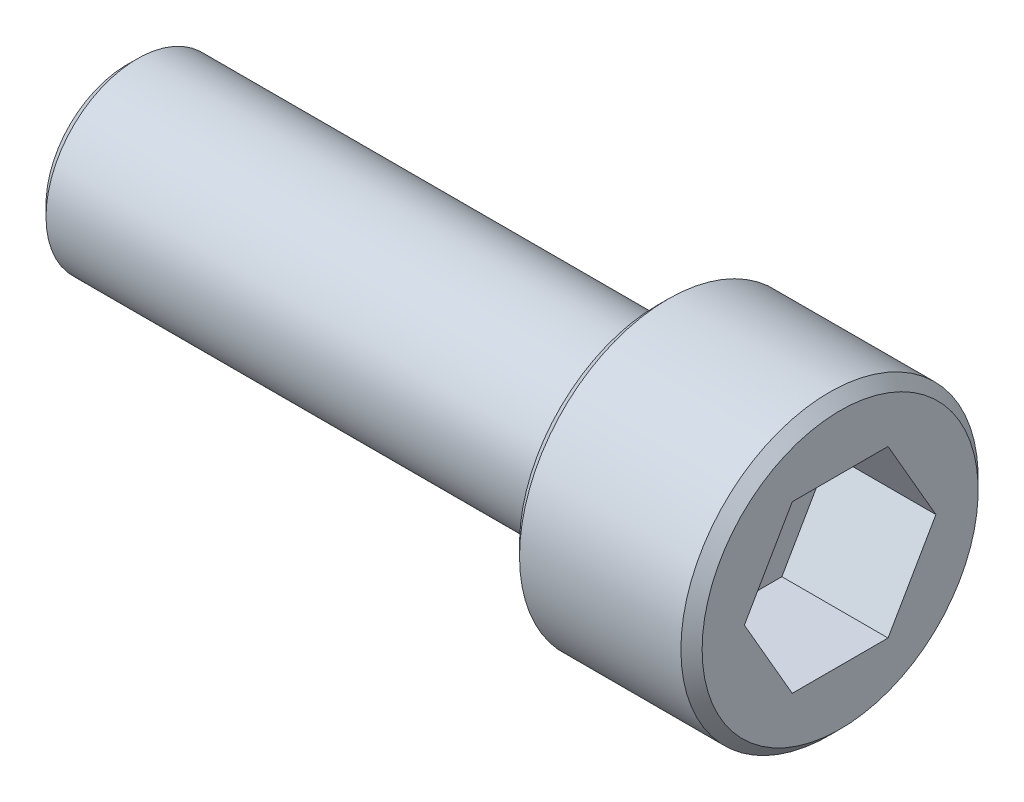
ISO-10303-21;
HEADER;
FILE_DESCRIPTION(('STEP AP214'),'2;1');
FILE_NAME('part.step','',(''),(''),'','','');
FILE_SCHEMA(('AUTOMOTIVE_DESIGN { 1 0 10303 214 1 1 1 1 }'));
ENDSEC;
DATA;
#1=APPLICATION_CONTEXT('core data for automotive mechanical design processes');
#2=APPLICATION_PROTOCOL_DEFINITION('international standard','automotive_design',2000,#1);
#3=PRODUCT_CONTEXT('',#1,'mechanical');
#4=PRODUCT('Part','Part','',(#3));
#5=PRODUCT_RELATED_PRODUCT_CATEGORY('part','',(#4));
#6=PRODUCT_DEFINITION_FORMATION('','',#4);
#7=PRODUCT_DEFINITION_CONTEXT('part definition',#1,'design');
#8=PRODUCT_DEFINITION('design','',#6,#7);
#9=PRODUCT_DEFINITION_SHAPE('','',#8);
#10=(LENGTH_UNIT() NAMED_UNIT(*) SI_UNIT(.MILLI.,.METRE.));
#11=(NAMED_UNIT(*) PLANE_ANGLE_UNIT() SI_UNIT($,.RADIAN.));
#12=(NAMED_UNIT(*) SI_UNIT($,.STERADIAN.) SOLID_ANGLE_UNIT());
#13=UNCERTAINTY_MEASURE_WITH_UNIT(LENGTH_MEASURE(1.E-05),#10,'distance_accuracy_value','');
#14=(GEOMETRIC_REPRESENTATION_CONTEXT(3) GLOBAL_UNCERTAINTY_ASSIGNED_CONTEXT((#13)) GLOBAL_UNIT_ASSIGNED_CONTEXT((#10,
#11,#12)) REPRESENTATION_CONTEXT('',''));
#15=CARTESIAN_POINT('',(0.,0.,0.));
#16=DIRECTION('',(0.,0.,1.));
#17=DIRECTION('',(1.,0.,0.));
#18=AXIS2_PLACEMENT_3D('',#15,#16,#17);
#19=CARTESIAN_POINT('',(7.2644,0.992187500000026,-0.572839720211604));
#20=DIRECTION('',(1.,0.,0.));
#21=DIRECTION('',(0.,0.,-1.));
#22=AXIS2_PLACEMENT_3D('',#19,#20,#21);
#23=PLANE('',#22);
#24=DIRECTION('',(0.,0.,1.));
#25=VECTOR('',#24,1.);
#26=CARTESIAN_POINT('',(7.26439999999923,-0.992187499999957,0.572839720211604));
#27=LINE('',#26,#25);
#28=CARTESIAN_POINT('',(7.26439999999981,-0.992187499999961,0.572839720211611));
#29=VERTEX_POINT('',#28);
#30=CARTESIAN_POINT('',(7.26439999999942,-0.9921875,-0.572839720211579));
#31=VERTEX_POINT('',#30);
#32=EDGE_CURVE('E90',#29,#31,#27,.F.);
#33=ORIENTED_EDGE('',*,*,#32,.T.);
#34=DIRECTION('',(0.,0.866025403784435,-0.500000000000006));
#35=VECTOR('',#34,1.);
#36=CARTESIAN_POINT('',(7.26439999999923,-0.992187499999957,-0.572839720211604));
#37=LINE('',#36,#35);
#38=CARTESIAN_POINT('',(7.26439999999962,0.,-1.14567944042315));
#39=VERTEX_POINT('',#38);
#40=EDGE_CURVE('E134',#31,#39,#37,.T.);
#41=ORIENTED_EDGE('',*,*,#40,.T.);
#42=DIRECTION('',(0.,0.866025403784435,0.500000000000006));
#43=VECTOR('',#42,1.);
#44=CARTESIAN_POINT('',(7.2644,0.,-1.1456794404231));
#45=LINE('',#44,#43);
#46=CARTESIAN_POINT('',(7.2644,0.992187500000006,-0.57283972021157));
#47=VERTEX_POINT('',#46);
#48=EDGE_CURVE('E129',#39,#47,#45,.T.);
#49=ORIENTED_EDGE('',*,*,#48,.T.);
#50=DIRECTION('',(0.,0.,1.));
#51=VECTOR('',#50,1.);
#52=CARTESIAN_POINT('',(7.2644,0.992187500000026,-0.572839720211604));
#53=LINE('',#52,#51);
#54=CARTESIAN_POINT('',(7.2644,0.992187499999989,0.572839720211632));
#55=VERTEX_POINT('',#54);
#56=EDGE_CURVE('E73',#47,#55,#53,.T.);
#57=ORIENTED_EDGE('',*,*,#56,.T.);
#58=DIRECTION('',(0.,-0.866025403784435,0.500000000000006));
#59=VECTOR('',#58,1.);
#60=CARTESIAN_POINT('',(7.2644,0.99218750000004,0.572839720211604));
#61=LINE('',#60,#59);
#62=CARTESIAN_POINT('',(7.26440000000001,0.,1.14567944042318));
#63=VERTEX_POINT('',#62);
#64=EDGE_CURVE('E70',#55,#63,#61,.T.);
#65=ORIENTED_EDGE('',*,*,#64,.T.);
#66=DIRECTION('',(0.,-0.866025403784435,-0.500000000000006));
#67=VECTOR('',#66,1.);
#68=CARTESIAN_POINT('',(7.2644,0.,1.14567944042321));
#69=LINE('',#68,#67);
#70=EDGE_CURVE('E67',#63,#29,#69,.T.);
#71=ORIENTED_EDGE('',*,*,#70,.T.);
#72=EDGE_LOOP('',(#33,#41,#49,#57,#65,#71));
#73=FACE_BOUND('',#72,.T.);
#74=ADVANCED_FACE('F16',(#73),#23,.T.);
#75=CARTESIAN_POINT('',(7.2644,0.99218750000004,0.572839720211604));
#76=DIRECTION('',(0.,0.500000000000006,0.866025403784435));
#77=DIRECTION('',(0.,-0.866025403784435,0.500000000000006));
#78=AXIS2_PLACEMENT_3D('',#75,#76,#77);
#79=PLANE('',#78);
#80=DIRECTION('',(1.,0.,0.));
#81=VECTOR('',#80,1.);
#82=CARTESIAN_POINT('',(7.2644,-1.2665089224229E-13,1.14567944042312));
#83=LINE('',#82,#81);
#84=CARTESIAN_POINT('',(8.5343999999998,0.,1.14567944042318));
#85=VERTEX_POINT('',#84);
#86=EDGE_CURVE('E76',#85,#63,#83,.F.);
#87=ORIENTED_EDGE('',*,*,#86,.T.);
#88=ORIENTED_EDGE('',*,*,#64,.F.);
#89=DIRECTION('',(1.,0.,0.));
#90=VECTOR('',#89,1.);
#91=CARTESIAN_POINT('',(7.2644,0.992187500000026,0.572839720211604));
#92=LINE('',#91,#90);
#93=CARTESIAN_POINT('',(8.5344,0.992187499999902,0.572839720211651));
#94=VERTEX_POINT('',#93);
#95=EDGE_CURVE('E124',#55,#94,#92,.T.);
#96=ORIENTED_EDGE('',*,*,#95,.T.);
#97=DIRECTION('',(0.,-0.866025403784431,0.500000000000013));
#98=VECTOR('',#97,1.);
#99=CARTESIAN_POINT('',(8.5344,0.992187499999825,0.572839720211604));
#100=LINE('',#99,#98);
#101=EDGE_CURVE('E81',#94,#85,#100,.T.);
#102=ORIENTED_EDGE('',*,*,#101,.T.);
#103=EDGE_LOOP('',(#87,#88,#96,#102));
#104=FACE_BOUND('',#103,.T.);
#105=ADVANCED_FACE('F79',(#104),#79,.F.);
#106=CARTESIAN_POINT('',(7.2644,0.,1.14567944042321));
#107=DIRECTION('',(0.,-0.500000000000006,0.866025403784435));
#108=DIRECTION('',(0.,-0.866025403784435,-0.500000000000006));
#109=AXIS2_PLACEMENT_3D('',#106,#107,#108);
#110=PLANE('',#109);
#111=DIRECTION('',(1.,0.,0.));
#112=VECTOR('',#111,1.);
#113=CARTESIAN_POINT('',(7.26439999999923,-0.992187499999957,0.572839720211604));
#114=LINE('',#113,#112);
#115=CARTESIAN_POINT('',(8.53439999999942,-0.992187500000018,0.572839720211611));
#116=VERTEX_POINT('',#115);
#117=EDGE_CURVE('E87',#116,#29,#114,.F.);
#118=ORIENTED_EDGE('',*,*,#117,.T.);
#119=ORIENTED_EDGE('',*,*,#70,.F.);
#120=ORIENTED_EDGE('',*,*,#86,.F.);
#121=DIRECTION('',(0.,-0.866025403784431,-0.500000000000013));
#122=VECTOR('',#121,1.);
#123=CARTESIAN_POINT('',(8.5344,-1.80411241501588E-13,1.14567944042321));
#124=LINE('',#123,#122);
#125=EDGE_CURVE('E121',#85,#116,#124,.T.);
#126=ORIENTED_EDGE('',*,*,#125,.T.);
#127=EDGE_LOOP('',(#118,#119,#120,#126));
#128=FACE_BOUND('',#127,.T.);
#129=ADVANCED_FACE('F85',(#128),#110,.F.);
#130=CARTESIAN_POINT('',(7.26439999999923,-0.992187499999957,0.572839720211604));
#131=DIRECTION('',(0.,-1.,0.));
#132=DIRECTION('',(1.,0.,0.));
#133=AXIS2_PLACEMENT_3D('',#130,#131,#132);
#134=PLANE('',#133);
#135=DIRECTION('',(1.,0.,0.));
#136=VECTOR('',#135,1.);
#137=CARTESIAN_POINT('',(7.26439999999923,-0.992187500000128,-0.572839720211505));
#138=LINE('',#137,#136);
#139=CARTESIAN_POINT('',(8.53439999999961,-0.992187500000057,-0.572839720211579));
#140=VERTEX_POINT('',#139);
#141=EDGE_CURVE('E136',#140,#31,#138,.F.);
#142=ORIENTED_EDGE('',*,*,#141,.T.);
#143=ORIENTED_EDGE('',*,*,#32,.F.);
#144=ORIENTED_EDGE('',*,*,#117,.F.);
#145=DIRECTION('',(0.,0.,1.));
#146=VECTOR('',#145,1.);
#147=CARTESIAN_POINT('',(8.5344,-0.992187500000186,0.));
#148=LINE('',#147,#146);
#149=EDGE_CURVE('E119',#116,#140,#148,.F.);
#150=ORIENTED_EDGE('',*,*,#149,.T.);
#151=EDGE_LOOP('',(#142,#143,#144,#150));
#152=FACE_BOUND('',#151,.T.);
#153=ADVANCED_FACE('F141',(#152),#134,.F.);
#154=CARTESIAN_POINT('',(7.26439999999923,-0.992187499999957,-0.572839720211604));
#155=DIRECTION('',(0.,-0.500000000000006,-0.866025403784435));
#156=DIRECTION('',(0.,0.866025403784435,-0.500000000000006));
#157=AXIS2_PLACEMENT_3D('',#154,#155,#156);
#158=PLANE('',#157);
#159=DIRECTION('',(1.,0.,0.));
#160=VECTOR('',#159,1.);
#161=CARTESIAN_POINT('',(7.2644,-1.00656521430497E-13,-1.14567944042318));
#162=LINE('',#161,#160);
#163=CARTESIAN_POINT('',(8.5344,0.,-1.14567944042315));
#164=VERTEX_POINT('',#163);
#165=EDGE_CURVE('E131',#164,#39,#162,.F.);
#166=ORIENTED_EDGE('',*,*,#165,.T.);
#167=ORIENTED_EDGE('',*,*,#40,.F.);
#168=ORIENTED_EDGE('',*,*,#141,.F.);
#169=DIRECTION('',(0.,0.866025403784481,-0.499999999999927));
#170=VECTOR('',#169,1.);
#171=CARTESIAN_POINT('',(8.5344,-0.992187500000186,-0.572839720211604));
#172=LINE('',#171,#170);
#173=EDGE_CURVE('E117',#140,#164,#172,.T.);
#174=ORIENTED_EDGE('',*,*,#173,.T.);
#175=EDGE_LOOP('',(#166,#167,#168,#174));
#176=FACE_BOUND('',#175,.T.);
#177=ADVANCED_FACE('F145',(#176),#158,.F.);
#178=CARTESIAN_POINT('',(7.2644,0.,-1.1456794404231));
#179=DIRECTION('',(0.,0.500000000000006,-0.866025403784435));
#180=DIRECTION('',(0.,0.866025403784435,0.500000000000006));
#181=AXIS2_PLACEMENT_3D('',#178,#179,#180);
#182=PLANE('',#181);
#183=DIRECTION('',(1.,0.,0.));
#184=VECTOR('',#183,1.);
#185=CARTESIAN_POINT('',(7.2644,0.992187500000026,-0.572839720211604));
#186=LINE('',#185,#184);
#187=CARTESIAN_POINT('',(8.5344,0.992187499999956,-0.57283972021157));
#188=VERTEX_POINT('',#187);
#189=EDGE_CURVE('E127',#188,#47,#186,.F.);
#190=ORIENTED_EDGE('',*,*,#189,.T.);
#191=ORIENTED_EDGE('',*,*,#48,.F.);
#192=ORIENTED_EDGE('',*,*,#165,.F.);
#193=DIRECTION('',(0.,0.866025403784466,0.499999999999953));
#194=VECTOR('',#193,1.);
#195=CARTESIAN_POINT('',(8.5344,-1.45716771982052E-13,-1.1456794404231));
#196=LINE('',#195,#194);
#197=EDGE_CURVE('E34',#164,#188,#196,.T.);
#198=ORIENTED_EDGE('',*,*,#197,.T.);
#199=EDGE_LOOP('',(#190,#191,#192,#198));
#200=FACE_BOUND('',#199,.T.);
#201=ADVANCED_FACE('F147',(#200),#182,.F.);
#202=CARTESIAN_POINT('',(7.2644,0.992187500000026,-0.572839720211604));
#203=DIRECTION('',(0.,1.,0.));
#204=DIRECTION('',(0.,0.,1.));
#205=AXIS2_PLACEMENT_3D('',#202,#203,#204);
#206=PLANE('',#205);
#207=ORIENTED_EDGE('',*,*,#95,.F.);
#208=ORIENTED_EDGE('',*,*,#56,.F.);
#209=ORIENTED_EDGE('',*,*,#189,.F.);
#210=DIRECTION('',(0.,0.,1.));
#211=VECTOR('',#210,1.);
#212=CARTESIAN_POINT('',(8.5344,0.992187499999825,0.));
#213=LINE('',#212,#211);
#214=EDGE_CURVE('E113',#188,#94,#213,.T.);
#215=ORIENTED_EDGE('',*,*,#214,.T.);
#216=EDGE_LOOP('',(#207,#208,#209,#215));
#217=FACE_BOUND('',#216,.T.);
#218=ADVANCED_FACE('F150',(#217),#206,.F.);
#219=CARTESIAN_POINT('',(8.5344,1.77799999999982,0.));
#220=DIRECTION('',(-1.,0.,0.));
#221=DIRECTION('',(0.,0.,1.));
#222=AXIS2_PLACEMENT_3D('',#219,#220,#221);
#223=PLANE('',#222);
#224=CARTESIAN_POINT('',(8.53440000003047,-1.45716771982052E-13,0.));
#225=DIRECTION('',(-1.,0.,0.));
#226=DIRECTION('',(0.,0.,1.));
#227=AXIS2_PLACEMENT_3D('',#224,#225,#226);
#228=CIRCLE('',#227,1.65100000003804);
#229=CARTESIAN_POINT('',(8.53440000003047,-1.45716771982052E-13,1.65100000003804));
#230=VERTEX_POINT('',#229);
#231=EDGE_CURVE('E19',#230,#230,#228,.T.);
#232=ORIENTED_EDGE('',*,*,#231,.F.);
#233=EDGE_LOOP('',(#232));
#234=FACE_BOUND('',#233,.T.);
#235=ORIENTED_EDGE('',*,*,#197,.F.);
#236=ORIENTED_EDGE('',*,*,#173,.F.);
#237=ORIENTED_EDGE('',*,*,#149,.F.);
#238=ORIENTED_EDGE('',*,*,#125,.F.);
#239=ORIENTED_EDGE('',*,*,#101,.F.);
#240=ORIENTED_EDGE('',*,*,#214,.F.);
#241=EDGE_LOOP('',(#235,#236,#237,#238,#239,#240));
#242=FACE_BOUND('',#241,.T.);
#243=ADVANCED_FACE('F152',(#234,#242),#223,.F.);
#244=CARTESIAN_POINT('',(8.40740000012375,-1.45716771982052E-13,0.));
#245=DIRECTION('',(-1.,0.,0.));
#246=DIRECTION('',(0.,0.,1.));
#247=AXIS2_PLACEMENT_3D('',#244,#245,#246);
#248=CONICAL_SURFACE('',#247,1.77799999994477,0.785398163397455);
#249=ORIENTED_EDGE('',*,*,#231,.T.);
#250=EDGE_LOOP('',(#249));
#251=FACE_BOUND('',#250,.T.);
#252=CARTESIAN_POINT('',(8.40740000000001,0.,1.34687893338032E-12));
#253=DIRECTION('',(-1.,0.,0.));
#254=DIRECTION('',(0.,0.,1.));
#255=AXIS2_PLACEMENT_3D('',#252,#253,#254);
#256=CIRCLE('',#255,1.77800000000002);
#257=CARTESIAN_POINT('',(8.40740000000001,0.,1.77800000000136));
#258=VERTEX_POINT('',#257);
#259=EDGE_CURVE('E104',#258,#258,#256,.T.);
#260=ORIENTED_EDGE('',*,*,#259,.F.);
#261=EDGE_LOOP('',(#260));
#262=FACE_BOUND('',#261,.T.);
#263=ADVANCED_FACE('F154',(#251,#262),#248,.T.);
#264=CARTESIAN_POINT('',(-41.7285714285714,0.,1.33226762955019E-12));
#265=DIRECTION('',(-1.,0.,0.));
#266=DIRECTION('',(0.,0.,1.));
#267=AXIS2_PLACEMENT_3D('',#264,#265,#266);
#268=CYLINDRICAL_SURFACE('',#267,1.77800000000002);
#269=ORIENTED_EDGE('',*,*,#259,.T.);
#270=EDGE_LOOP('',(#269));
#271=FACE_BOUND('',#270,.T.);
#272=CARTESIAN_POINT('',(6.47700000001805,0.,0.));
#273=DIRECTION('',(1.,0.,0.));
#274=DIRECTION('',(0.,0.,-1.));
#275=AXIS2_PLACEMENT_3D('',#272,#273,#274);
#276=CIRCLE('',#275,1.77799999994477);
#277=CARTESIAN_POINT('',(6.47700000001805,0.,-1.77799999994477));
#278=VERTEX_POINT('',#277);
#279=EDGE_CURVE('E100',#278,#278,#276,.F.);
#280=ORIENTED_EDGE('',*,*,#279,.F.);
#281=EDGE_LOOP('',(#280));
#282=FACE_BOUND('',#281,.T.);
#283=ADVANCED_FACE('F162',(#271,#282),#268,.T.);
#284=CARTESIAN_POINT('',(6.47699999990436,0.,0.));
#285=DIRECTION('',(1.,0.,0.));
#286=DIRECTION('',(0.,1.,0.));
#287=AXIS2_PLACEMENT_3D('',#284,#285,#286);
#288=CONICAL_SURFACE('',#287,1.77799999988792,0.785398163397448);
#289=CARTESIAN_POINT('',(6.34999999994079,0.,0.));
#290=DIRECTION('',(1.,0.,0.));
#291=DIRECTION('',(0.,1.,0.));
#292=AXIS2_PLACEMENT_3D('',#289,#290,#291);
#293=CIRCLE('',#292,1.65099999992435);
#294=CARTESIAN_POINT('',(6.34999999994079,1.65099999992435,0.));
#295=VERTEX_POINT('',#294);
#296=EDGE_CURVE('E98',#295,#295,#293,.T.);
#297=ORIENTED_EDGE('',*,*,#296,.T.);
#298=EDGE_LOOP('',(#297));
#299=FACE_BOUND('',#298,.T.);
#300=ORIENTED_EDGE('',*,*,#279,.T.);
#301=EDGE_LOOP('',(#300));
#302=FACE_BOUND('',#301,.T.);
#303=ADVANCED_FACE('F186',(#299,#302),#288,.T.);
#304=CARTESIAN_POINT('',(0.,0.,0.));
#305=DIRECTION('',(1.,0.,0.));
#306=DIRECTION('',(0.,0.,-1.));
#307=AXIS2_PLACEMENT_3D('',#304,#305,#306);
#308=PLANE('',#307);
#309=CARTESIAN_POINT('',(0.,0.,0.));
#310=DIRECTION('',(1.,0.,0.));
#311=DIRECTION('',(0.,0.,-1.));
#312=AXIS2_PLACEMENT_3D('',#309,#310,#311);
#313=CIRCLE('',#312,0.965199999996003);
#314=CARTESIAN_POINT('',(0.,0.,-0.965199999996003));
#315=VERTEX_POINT('',#314);
#316=EDGE_CURVE('E96',#315,#315,#313,.T.);
#317=ORIENTED_EDGE('',*,*,#316,.F.);
#318=EDGE_LOOP('',(#317));
#319=FACE_BOUND('',#318,.T.);
#320=ADVANCED_FACE('F182',(#319),#308,.F.);
#321=CARTESIAN_POINT('',(6.35000000000002,1.09219999999999,0.));
#322=DIRECTION('',(1.,0.,0.));
#323=DIRECTION('',(0.,0.,-1.));
#324=AXIS2_PLACEMENT_3D('',#321,#322,#323);
#325=PLANE('',#324);
#326=CARTESIAN_POINT('',(6.35000000000002,0.,1.3462793380071E-12));
#327=DIRECTION('',(-1.,0.,0.));
#328=DIRECTION('',(0.,0.,1.));
#329=AXIS2_PLACEMENT_3D('',#326,#327,#328);
#330=CIRCLE('',#329,1.09220000000001);
#331=CARTESIAN_POINT('',(6.35000000000002,0.,1.09220000000136));
#332=VERTEX_POINT('',#331);
#333=EDGE_CURVE('E25',#332,#332,#330,.T.);
#334=ORIENTED_EDGE('',*,*,#333,.F.);
#335=EDGE_LOOP('',(#334));
#336=FACE_BOUND('',#335,.T.);
#337=ORIENTED_EDGE('',*,*,#296,.F.);
#338=EDGE_LOOP('',(#337));
#339=FACE_BOUND('',#338,.T.);
#340=ADVANCED_FACE('F175',(#336,#339),#325,.F.);
#341=CARTESIAN_POINT('',(0.126999999963573,0.,0.));
#342=DIRECTION('',(1.,0.,0.));
#343=DIRECTION('',(0.,0.,-1.));
#344=AXIS2_PLACEMENT_3D('',#341,#342,#343);
#345=CONICAL_SURFACE('',#344,1.09219999995958,0.785398163397448);
#346=CARTESIAN_POINT('',(0.126999999999988,0.,1.34446574706344E-12));
#347=DIRECTION('',(-1.,0.,0.));
#348=DIRECTION('',(0.,0.,1.));
#349=AXIS2_PLACEMENT_3D('',#346,#347,#348);
#350=CIRCLE('',#349,1.09220000000001);
#351=CARTESIAN_POINT('',(0.126999999999988,0.,1.09220000000135));
#352=VERTEX_POINT('',#351);
#353=EDGE_CURVE('E11',#352,#352,#350,.F.);
#354=ORIENTED_EDGE('',*,*,#353,.F.);
#355=EDGE_LOOP('',(#354));
#356=FACE_BOUND('',#355,.T.);
#357=ORIENTED_EDGE('',*,*,#316,.T.);
#358=EDGE_LOOP('',(#357));
#359=FACE_BOUND('',#358,.T.);
#360=ADVANCED_FACE('F169',(#356,#359),#345,.T.);
#361=CARTESIAN_POINT('',(-41.7285714285714,0.,1.33226762955019E-12));
#362=DIRECTION('',(-1.,0.,0.));
#363=DIRECTION('',(0.,0.,1.));
#364=AXIS2_PLACEMENT_3D('',#361,#362,#363);
#365=CYLINDRICAL_SURFACE('',#364,1.09220000000001);
#366=ORIENTED_EDGE('',*,*,#353,.T.);
#367=EDGE_LOOP('',(#366));
#368=FACE_BOUND('',#367,.T.);
#369=ORIENTED_EDGE('',*,*,#333,.T.);
#370=EDGE_LOOP('',(#369));
#371=FACE_BOUND('',#370,.T.);
#372=ADVANCED_FACE('F167',(#368,#371),#365,.T.);
#373=CLOSED_SHELL('',(#74,#105,#129,#153,#177,#201,#218,#243,#263,#283,#303,#320,#340,#360,#372));
#374=MANIFOLD_SOLID_BREP('B1',#373);
#375=ADVANCED_BREP_SHAPE_REPRESENTATION('',(#18,#374),#14);
#376=SHAPE_DEFINITION_REPRESENTATION(#9,#375);
ENDSEC;
END-ISO-10303-21;
